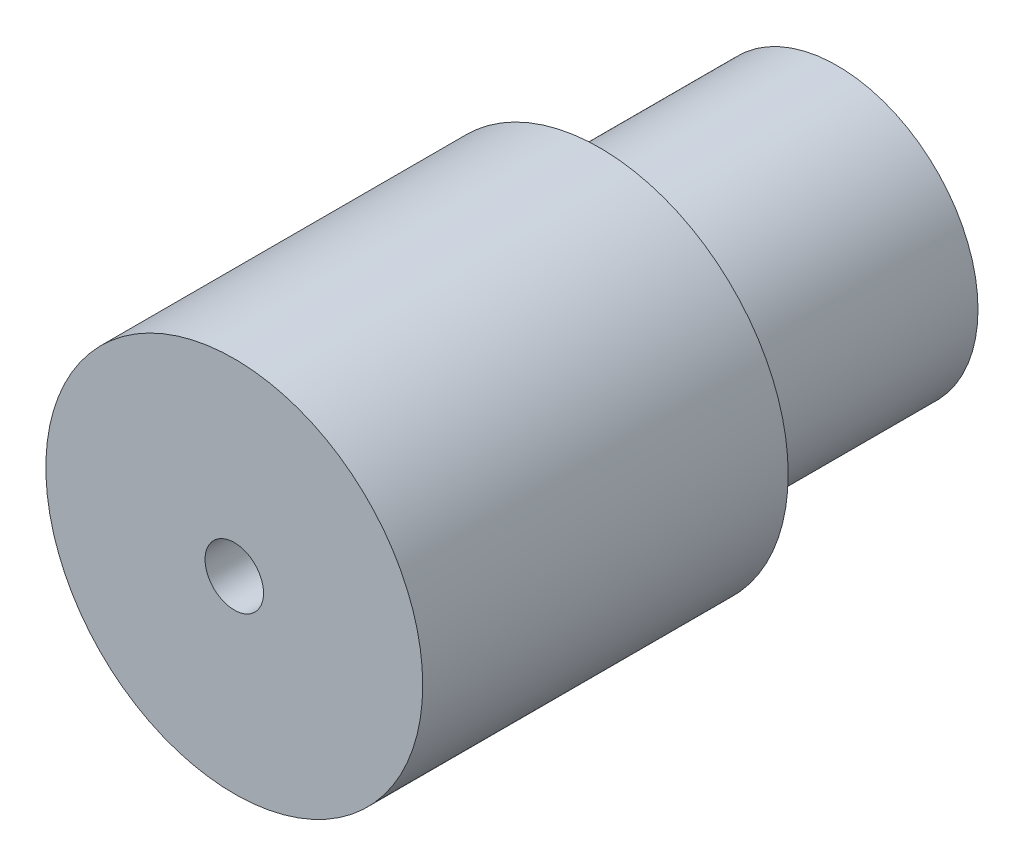
ISO-10303-21;
HEADER;
FILE_DESCRIPTION(('STEP AP214'),'2;1');
FILE_NAME('part.step','',(''),(''),'','','');
FILE_SCHEMA(('AUTOMOTIVE_DESIGN { 1 0 10303 214 1 1 1 1 }'));
ENDSEC;
DATA;
#1=APPLICATION_CONTEXT('core data for automotive mechanical design processes');
#2=APPLICATION_PROTOCOL_DEFINITION('international standard','automotive_design',2000,#1);
#3=PRODUCT_CONTEXT('',#1,'mechanical');
#4=PRODUCT('Part','Part','',(#3));
#5=PRODUCT_RELATED_PRODUCT_CATEGORY('part','',(#4));
#6=PRODUCT_DEFINITION_FORMATION('','',#4);
#7=PRODUCT_DEFINITION_CONTEXT('part definition',#1,'design');
#8=PRODUCT_DEFINITION('design','',#6,#7);
#9=PRODUCT_DEFINITION_SHAPE('','',#8);
#10=(LENGTH_UNIT() NAMED_UNIT(*) SI_UNIT(.MILLI.,.METRE.));
#11=(NAMED_UNIT(*) PLANE_ANGLE_UNIT() SI_UNIT($,.RADIAN.));
#12=(NAMED_UNIT(*) SI_UNIT($,.STERADIAN.) SOLID_ANGLE_UNIT());
#13=UNCERTAINTY_MEASURE_WITH_UNIT(LENGTH_MEASURE(1.E-05),#10,'distance_accuracy_value','');
#14=(GEOMETRIC_REPRESENTATION_CONTEXT(3) GLOBAL_UNCERTAINTY_ASSIGNED_CONTEXT((#13)) GLOBAL_UNIT_ASSIGNED_CONTEXT((#10,
#11,#12)) REPRESENTATION_CONTEXT('',''));
#15=CARTESIAN_POINT('',(0.,0.,0.));
#16=DIRECTION('',(0.,0.,1.));
#17=DIRECTION('',(1.,0.,0.));
#18=AXIS2_PLACEMENT_3D('',#15,#16,#17);
#19=CARTESIAN_POINT('',(0.,0.,-10.));
#20=DIRECTION('',(0.,0.,1.));
#21=DIRECTION('',(1.,0.,0.));
#22=AXIS2_PLACEMENT_3D('',#19,#20,#21);
#23=CYLINDRICAL_SURFACE('',#22,5.15625012130745);
#24=CARTESIAN_POINT('',(0.,0.,-10.));
#25=DIRECTION('',(0.,0.,1.));
#26=DIRECTION('',(1.,0.,0.));
#27=AXIS2_PLACEMENT_3D('',#24,#25,#26);
#28=CIRCLE('',#27,5.15625012130745);
#29=CARTESIAN_POINT('',(5.15625012130745,0.,-10.));
#30=VERTEX_POINT('',#29);
#31=EDGE_CURVE('E46',#30,#30,#28,.T.);
#32=ORIENTED_EDGE('',*,*,#31,.T.);
#33=EDGE_LOOP('',(#32));
#34=FACE_BOUND('',#33,.T.);
#35=CARTESIAN_POINT('',(0.,0.,0.));
#36=DIRECTION('',(0.,0.,1.));
#37=DIRECTION('',(1.,0.,0.));
#38=AXIS2_PLACEMENT_3D('',#35,#36,#37);
#39=CIRCLE('',#38,5.15625012130745);
#40=CARTESIAN_POINT('',(5.15625012130745,0.,0.));
#41=VERTEX_POINT('',#40);
#42=EDGE_CURVE('E42',#41,#41,#39,.T.);
#43=ORIENTED_EDGE('',*,*,#42,.F.);
#44=EDGE_LOOP('',(#43));
#45=FACE_BOUND('',#44,.T.);
#46=ADVANCED_FACE('F39',(#34,#45),#23,.T.);
#47=CARTESIAN_POINT('',(0.,0.,-10.));
#48=DIRECTION('',(0.,0.,1.));
#49=DIRECTION('',(1.,0.,0.));
#50=AXIS2_PLACEMENT_3D('',#47,#48,#49);
#51=PLANE('',#50);
#52=CARTESIAN_POINT('',(0.,0.,-10.));
#53=DIRECTION('',(0.,0.,-1.));
#54=DIRECTION('',(-1.,0.,0.));
#55=AXIS2_PLACEMENT_3D('',#52,#53,#54);
#56=CIRCLE('',#55,3.85);
#57=CARTESIAN_POINT('',(3.85,0.,-10.));
#58=VERTEX_POINT('',#57);
#59=EDGE_CURVE('E10',#58,#58,#56,.T.);
#60=ORIENTED_EDGE('',*,*,#59,.F.);
#61=EDGE_LOOP('',(#60));
#62=FACE_BOUND('',#61,.T.);
#63=ORIENTED_EDGE('',*,*,#31,.F.);
#64=EDGE_LOOP('',(#63));
#65=FACE_BOUND('',#64,.T.);
#66=ADVANCED_FACE('F75',(#62,#65),#51,.F.);
#67=CARTESIAN_POINT('',(0.,0.,0.));
#68=DIRECTION('',(0.,0.,1.));
#69=DIRECTION('',(1.,0.,0.));
#70=AXIS2_PLACEMENT_3D('',#67,#68,#69);
#71=PLANE('',#70);
#72=CARTESIAN_POINT('',(0.,0.,0.));
#73=DIRECTION('',(0.,0.,1.));
#74=DIRECTION('',(1.,0.,0.));
#75=AXIS2_PLACEMENT_3D('',#72,#73,#74);
#76=CIRCLE('',#75,0.8);
#77=CARTESIAN_POINT('',(0.8,0.,0.));
#78=VERTEX_POINT('',#77);
#79=EDGE_CURVE('E55',#78,#78,#76,.T.);
#80=ORIENTED_EDGE('',*,*,#79,.F.);
#81=EDGE_LOOP('',(#80));
#82=FACE_BOUND('',#81,.T.);
#83=ORIENTED_EDGE('',*,*,#42,.T.);
#84=EDGE_LOOP('',(#83));
#85=FACE_BOUND('',#84,.T.);
#86=ADVANCED_FACE('F80',(#82,#85),#71,.T.);
#87=CARTESIAN_POINT('',(0.,0.,-16.5));
#88=DIRECTION('',(0.,0.,1.));
#89=DIRECTION('',(1.,0.,0.));
#90=AXIS2_PLACEMENT_3D('',#87,#88,#89);
#91=CYLINDRICAL_SURFACE('',#90,3.85);
#92=CARTESIAN_POINT('',(0.,0.,-16.5));
#93=DIRECTION('',(0.,0.,-1.));
#94=DIRECTION('',(-1.,0.,0.));
#95=AXIS2_PLACEMENT_3D('',#92,#93,#94);
#96=CIRCLE('',#95,3.85);
#97=CARTESIAN_POINT('',(3.85,0.,-16.5));
#98=VERTEX_POINT('',#97);
#99=EDGE_CURVE('E52',#98,#98,#96,.T.);
#100=CARTESIAN_POINT('',(3.85,0.,-16.5));
#101=CARTESIAN_POINT('',(3.85,0.,-16.4322916666667));
#102=CARTESIAN_POINT('',(3.85,0.,-16.3645833333333));
#103=CARTESIAN_POINT('',(3.85,0.,-16.2291666666667));
#104=CARTESIAN_POINT('',(3.85,0.,-16.1614583333333));
#105=CARTESIAN_POINT('',(3.85,0.,-16.0260416666667));
#106=CARTESIAN_POINT('',(3.85,0.,-15.9583333333333));
#107=CARTESIAN_POINT('',(3.85,0.,-15.8229166666667));
#108=CARTESIAN_POINT('',(3.85,0.,-15.7552083333333));
#109=CARTESIAN_POINT('',(3.85,0.,-15.6197916666667));
#110=CARTESIAN_POINT('',(3.85,0.,-15.5520833333333));
#111=CARTESIAN_POINT('',(3.85,0.,-15.4166666666667));
#112=CARTESIAN_POINT('',(3.85,0.,-15.3489583333333));
#113=CARTESIAN_POINT('',(3.85,0.,-15.2135416666667));
#114=CARTESIAN_POINT('',(3.85,0.,-15.1458333333333));
#115=CARTESIAN_POINT('',(3.85,0.,-15.0104166666667));
#116=CARTESIAN_POINT('',(3.85,0.,-14.9427083333333));
#117=CARTESIAN_POINT('',(3.85,0.,-14.8072916666667));
#118=CARTESIAN_POINT('',(3.85,0.,-14.7395833333333));
#119=CARTESIAN_POINT('',(3.85,0.,-14.6041666666667));
#120=CARTESIAN_POINT('',(3.85,0.,-14.5364583333333));
#121=CARTESIAN_POINT('',(3.85,0.,-14.4010416666667));
#122=CARTESIAN_POINT('',(3.85,0.,-14.3333333333333));
#123=CARTESIAN_POINT('',(3.85,0.,-14.1979166666667));
#124=CARTESIAN_POINT('',(3.85,0.,-14.1302083333333));
#125=CARTESIAN_POINT('',(3.85,0.,-13.9947916666667));
#126=CARTESIAN_POINT('',(3.85,0.,-13.9270833333333));
#127=CARTESIAN_POINT('',(3.85,0.,-13.7916666666667));
#128=CARTESIAN_POINT('',(3.85,0.,-13.7239583333333));
#129=CARTESIAN_POINT('',(3.85,0.,-13.5885416666667));
#130=CARTESIAN_POINT('',(3.85,0.,-13.5208333333333));
#131=CARTESIAN_POINT('',(3.85,0.,-13.3854166666667));
#132=CARTESIAN_POINT('',(3.85,0.,-13.3177083333333));
#133=CARTESIAN_POINT('',(3.85,0.,-13.1822916666667));
#134=CARTESIAN_POINT('',(3.85,0.,-13.1145833333333));
#135=CARTESIAN_POINT('',(3.85,0.,-12.9791666666667));
#136=CARTESIAN_POINT('',(3.85,0.,-12.9114583333333));
#137=CARTESIAN_POINT('',(3.85,0.,-12.7760416666667));
#138=CARTESIAN_POINT('',(3.85,0.,-12.7083333333333));
#139=CARTESIAN_POINT('',(3.85,0.,-12.5729166666667));
#140=CARTESIAN_POINT('',(3.85,0.,-12.5052083333333));
#141=CARTESIAN_POINT('',(3.85,0.,-12.3697916666667));
#142=CARTESIAN_POINT('',(3.85,0.,-12.3020833333333));
#143=CARTESIAN_POINT('',(3.85,0.,-12.1666666666667));
#144=CARTESIAN_POINT('',(3.85,0.,-12.0989583333333));
#145=CARTESIAN_POINT('',(3.85,0.,-11.9635416666667));
#146=CARTESIAN_POINT('',(3.85,0.,-11.8958333333333));
#147=CARTESIAN_POINT('',(3.85,0.,-11.7604166666667));
#148=CARTESIAN_POINT('',(3.85,0.,-11.6927083333333));
#149=CARTESIAN_POINT('',(3.85,0.,-11.5572916666667));
#150=CARTESIAN_POINT('',(3.85,0.,-11.4895833333333));
#151=CARTESIAN_POINT('',(3.85,0.,-11.3541666666667));
#152=CARTESIAN_POINT('',(3.85,0.,-11.2864583333333));
#153=CARTESIAN_POINT('',(3.85,0.,-11.1510416666667));
#154=CARTESIAN_POINT('',(3.85,0.,-11.0833333333333));
#155=CARTESIAN_POINT('',(3.85,0.,-10.9479166666667));
#156=CARTESIAN_POINT('',(3.85,0.,-10.8802083333333));
#157=CARTESIAN_POINT('',(3.85,0.,-10.7447916666667));
#158=CARTESIAN_POINT('',(3.85,0.,-10.6770833333333));
#159=CARTESIAN_POINT('',(3.85,0.,-10.5416666666667));
#160=CARTESIAN_POINT('',(3.85,0.,-10.4739583333333));
#161=CARTESIAN_POINT('',(3.85,0.,-10.3385416666667));
#162=CARTESIAN_POINT('',(3.85,0.,-10.2708333333333));
#163=CARTESIAN_POINT('',(3.85,0.,-10.1354166666667));
#164=CARTESIAN_POINT('',(3.85,0.,-10.0677083333333));
#165=CARTESIAN_POINT('',(3.85,0.,-10.));
#166=B_SPLINE_CURVE_WITH_KNOTS('',3,(#100,#101,#102,#103,#104,#105,#106,#107,#108,#109,#110,
#111,#112,#113,#114,#115,#116,#117,#118,#119,#120,#121,#122,#123,#124,#125,#126,#127,#128,#129,
#130,#131,#132,#133,#134,#135,#136,#137,#138,#139,#140,#141,#142,#143,#144,#145,#146,#147,#148,
#149,#150,#151,#152,#153,#154,#155,#156,#157,#158,#159,#160,#161,#162,#163,#164,#165),
.UNSPECIFIED.,.F.,.F.,(4,2,2,2,2,2,2,2,2,2,2,2,2,2,2,2,2,2,2,2,2,2,2,2,2,2,2,2,2,2,2,2,4),(0.,
0.203125000000002,0.40625,0.609375000000002,0.812500000000001,1.015625,1.21875,1.421875,1.625,
1.828125,2.03125,2.234375,2.4375,2.640625,2.84375,3.046875,3.25,3.453125,3.65625,3.859375,
4.0625,4.265625,4.46875,4.671875,4.875,5.078125,5.28125,5.484375,5.6875,5.890625,6.09375,
6.296875,6.5),.UNSPECIFIED.);
#167=EDGE_CURVE('BSEAM72',#98,#58,#166,.T.);
#168=ORIENTED_EDGE('',*,*,#99,.F.);
#169=ORIENTED_EDGE('',*,*,#59,.T.);
#170=ORIENTED_EDGE('',*,*,#167,.T.);
#171=ORIENTED_EDGE('',*,*,#167,.F.);
#172=EDGE_LOOP('',(#168,#170,#169,#171));
#173=FACE_BOUND('',#172,.T.);
#174=ADVANCED_FACE('F72',(#173),#91,.T.);
#175=CARTESIAN_POINT('',(0.,0.,-16.5));
#176=DIRECTION('',(0.,0.,-1.));
#177=DIRECTION('',(-1.,0.,0.));
#178=AXIS2_PLACEMENT_3D('',#175,#176,#177);
#179=PLANE('',#178);
#180=CARTESIAN_POINT('',(0.,0.,-16.5));
#181=DIRECTION('',(0.,0.,1.));
#182=DIRECTION('',(1.,0.,0.));
#183=AXIS2_PLACEMENT_3D('',#180,#181,#182);
#184=CIRCLE('',#183,0.8);
#185=CARTESIAN_POINT('',(0.8,0.,-16.5));
#186=VERTEX_POINT('',#185);
#187=EDGE_CURVE('E58',#186,#186,#184,.T.);
#188=ORIENTED_EDGE('',*,*,#187,.T.);
#189=EDGE_LOOP('',(#188));
#190=FACE_BOUND('',#189,.T.);
#191=ORIENTED_EDGE('',*,*,#99,.T.);
#192=EDGE_LOOP('',(#191));
#193=FACE_BOUND('',#192,.T.);
#194=ADVANCED_FACE('F62',(#190,#193),#179,.T.);
#195=CARTESIAN_POINT('',(0.,0.,-16.5));
#196=DIRECTION('',(0.,0.,1.));
#197=DIRECTION('',(1.,0.,0.));
#198=AXIS2_PLACEMENT_3D('',#195,#196,#197);
#199=CYLINDRICAL_SURFACE('',#198,0.8);
#200=ORIENTED_EDGE('',*,*,#79,.T.);
#201=EDGE_LOOP('',(#200));
#202=FACE_BOUND('',#201,.T.);
#203=ORIENTED_EDGE('',*,*,#187,.F.);
#204=EDGE_LOOP('',(#203));
#205=FACE_BOUND('',#204,.T.);
#206=ADVANCED_FACE('F65',(#202,#205),#199,.F.);
#207=CLOSED_SHELL('',(#46,#66,#86,#174,#194,#206));
#208=MANIFOLD_SOLID_BREP('B2',#207);
#209=ADVANCED_BREP_SHAPE_REPRESENTATION('',(#18,#208),#14);
#210=SHAPE_DEFINITION_REPRESENTATION(#9,#209);
ENDSEC;
END-ISO-10303-21;
